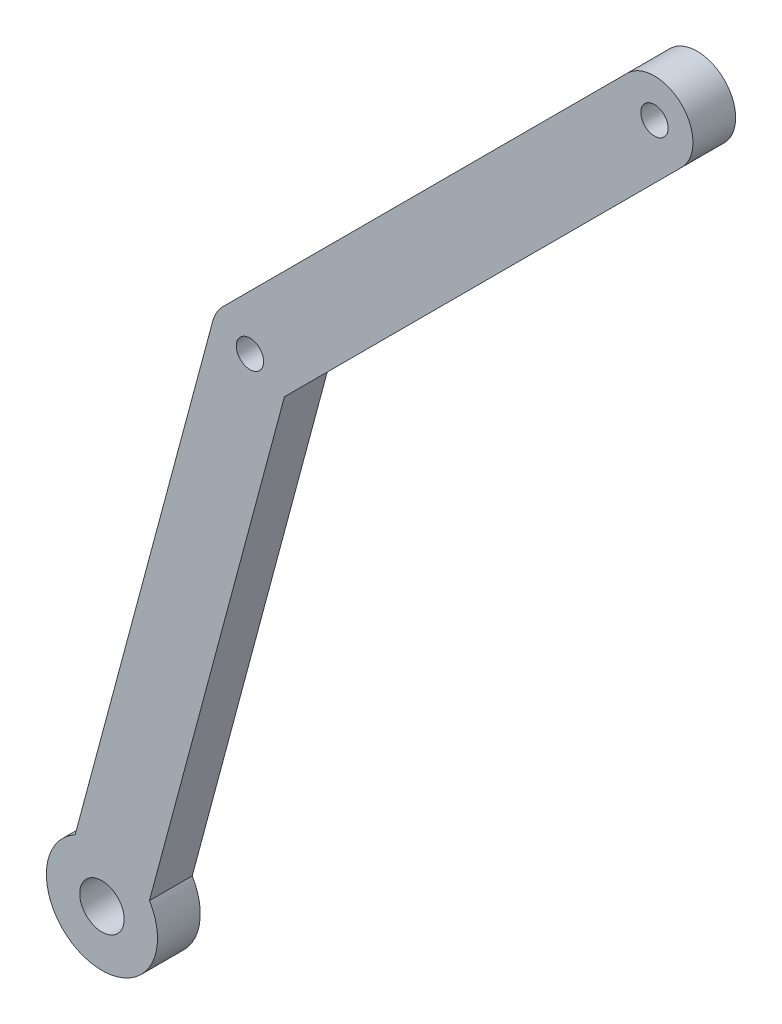
ISO-10303-21;
HEADER;
FILE_DESCRIPTION(('STEP AP214'),'2;1');
FILE_NAME('part.step','',(''),(''),'','','');
FILE_SCHEMA(('AUTOMOTIVE_DESIGN { 1 0 10303 214 1 1 1 1 }'));
ENDSEC;
DATA;
#1=APPLICATION_CONTEXT('core data for automotive mechanical design processes');
#2=APPLICATION_PROTOCOL_DEFINITION('international standard','automotive_design',2000,#1);
#3=PRODUCT_CONTEXT('',#1,'mechanical');
#4=PRODUCT('Part','Part','',(#3));
#5=PRODUCT_RELATED_PRODUCT_CATEGORY('part','',(#4));
#6=PRODUCT_DEFINITION_FORMATION('','',#4);
#7=PRODUCT_DEFINITION_CONTEXT('part definition',#1,'design');
#8=PRODUCT_DEFINITION('design','',#6,#7);
#9=PRODUCT_DEFINITION_SHAPE('','',#8);
#10=(LENGTH_UNIT() NAMED_UNIT(*) SI_UNIT(.MILLI.,.METRE.));
#11=(NAMED_UNIT(*) PLANE_ANGLE_UNIT() SI_UNIT($,.RADIAN.));
#12=(NAMED_UNIT(*) SI_UNIT($,.STERADIAN.) SOLID_ANGLE_UNIT());
#13=UNCERTAINTY_MEASURE_WITH_UNIT(LENGTH_MEASURE(1.E-05),#10,'distance_accuracy_value','');
#14=(GEOMETRIC_REPRESENTATION_CONTEXT(3) GLOBAL_UNCERTAINTY_ASSIGNED_CONTEXT((#13)) GLOBAL_UNIT_ASSIGNED_CONTEXT((#10,
#11,#12)) REPRESENTATION_CONTEXT('',''));
#15=CARTESIAN_POINT('',(0.,0.,0.));
#16=DIRECTION('',(0.,0.,1.));
#17=DIRECTION('',(1.,0.,0.));
#18=AXIS2_PLACEMENT_3D('',#15,#16,#17);
#19=CARTESIAN_POINT('',(-119.3283582089,-55.97014925373,11.));
#20=DIRECTION('',(0.,0.,1.));
#21=DIRECTION('',(1.,0.,0.));
#22=AXIS2_PLACEMENT_3D('',#19,#20,#21);
#23=CYLINDRICAL_SURFACE('',#22,2.6);
#24=DIRECTION('',(0.,0.,1.));
#25=VECTOR('',#24,1.);
#26=CARTESIAN_POINT('',(-116.7283582089,-55.97014925373,11.));
#27=LINE('',#26,#25);
#28=CARTESIAN_POINT('',(-116.7283582089,-55.97014925373,18.5));
#29=VERTEX_POINT('',#28);
#30=CARTESIAN_POINT('',(-116.7283582089,-55.97014925373,23.5));
#31=VERTEX_POINT('',#30);
#32=EDGE_CURVE('E10',#29,#31,#27,.T.);
#33=ORIENTED_EDGE('',*,*,#32,.F.);
#34=CARTESIAN_POINT('',(-119.3283582089,-55.97014925373,18.5));
#35=DIRECTION('',(0.,0.,1.));
#36=DIRECTION('',(1.,0.,0.));
#37=AXIS2_PLACEMENT_3D('',#34,#35,#36);
#38=CIRCLE('',#37,2.6);
#39=EDGE_CURVE('E175',#29,#29,#38,.T.);
#40=ORIENTED_EDGE('',*,*,#39,.F.);
#41=ORIENTED_EDGE('',*,*,#32,.T.);
#42=CARTESIAN_POINT('',(-119.3283582089,-55.97014925373,23.5));
#43=DIRECTION('',(0.,0.,1.));
#44=DIRECTION('',(1.,0.,0.));
#45=AXIS2_PLACEMENT_3D('',#42,#43,#44);
#46=CIRCLE('',#45,2.6);
#47=EDGE_CURVE('E166',#31,#31,#46,.T.);
#48=ORIENTED_EDGE('',*,*,#47,.T.);
#49=EDGE_LOOP('',(#33,#40,#41,#48));
#50=FACE_BOUND('',#49,.T.);
#51=ADVANCED_FACE('F16',(#50),#23,.F.);
#52=CARTESIAN_POINT('',(-102.0149253731,8.65671641791,11.));
#53=DIRECTION('',(0.,0.,1.));
#54=DIRECTION('',(1.,0.,0.));
#55=AXIS2_PLACEMENT_3D('',#52,#53,#54);
#56=CYLINDRICAL_SURFACE('',#55,1.6);
#57=DIRECTION('',(0.,0.,1.));
#58=VECTOR('',#57,1.);
#59=CARTESIAN_POINT('',(-100.4149253731,8.65671641791,11.));
#60=LINE('',#59,#58);
#61=CARTESIAN_POINT('',(-100.4149253731,8.65671641791,18.5));
#62=VERTEX_POINT('',#61);
#63=CARTESIAN_POINT('',(-100.4149253731,8.65671641791,23.5));
#64=VERTEX_POINT('',#63);
#65=EDGE_CURVE('E27',#62,#64,#60,.T.);
#66=ORIENTED_EDGE('',*,*,#65,.F.);
#67=CARTESIAN_POINT('',(-102.0149253731,8.65671641791,18.5));
#68=DIRECTION('',(0.,0.,1.));
#69=DIRECTION('',(1.,0.,0.));
#70=AXIS2_PLACEMENT_3D('',#67,#68,#69);
#71=CIRCLE('',#70,1.6);
#72=EDGE_CURVE('E152',#62,#62,#71,.T.);
#73=ORIENTED_EDGE('',*,*,#72,.F.);
#74=ORIENTED_EDGE('',*,*,#65,.T.);
#75=CARTESIAN_POINT('',(-102.0149253731,8.65671641791,23.5));
#76=DIRECTION('',(0.,0.,1.));
#77=DIRECTION('',(1.,0.,0.));
#78=AXIS2_PLACEMENT_3D('',#75,#76,#77);
#79=CIRCLE('',#78,1.6);
#80=EDGE_CURVE('E162',#64,#64,#79,.T.);
#81=ORIENTED_EDGE('',*,*,#80,.T.);
#82=EDGE_LOOP('',(#66,#73,#74,#81));
#83=FACE_BOUND('',#82,.T.);
#84=ADVANCED_FACE('F234',(#83),#56,.F.);
#85=CARTESIAN_POINT('',(-54.70149253731,55.970149253731,11.));
#86=DIRECTION('',(0.,0.,1.));
#87=DIRECTION('',(1.,0.,0.));
#88=AXIS2_PLACEMENT_3D('',#85,#86,#87);
#89=CYLINDRICAL_SURFACE('',#88,1.6);
#90=DIRECTION('',(0.,0.,1.));
#91=VECTOR('',#90,1.);
#92=CARTESIAN_POINT('',(-53.10149253731,55.970149253731,11.));
#93=LINE('',#92,#91);
#94=CARTESIAN_POINT('',(-53.10149253731,55.970149253731,18.5));
#95=VERTEX_POINT('',#94);
#96=CARTESIAN_POINT('',(-53.10149253731,55.970149253731,23.5));
#97=VERTEX_POINT('',#96);
#98=EDGE_CURVE('E210',#95,#97,#93,.T.);
#99=ORIENTED_EDGE('',*,*,#98,.F.);
#100=CARTESIAN_POINT('',(-54.70149253731,55.970149253731,18.5));
#101=DIRECTION('',(0.,0.,1.));
#102=DIRECTION('',(1.,0.,0.));
#103=AXIS2_PLACEMENT_3D('',#100,#101,#102);
#104=CIRCLE('',#103,1.6);
#105=EDGE_CURVE('E156',#95,#95,#104,.T.);
#106=ORIENTED_EDGE('',*,*,#105,.F.);
#107=ORIENTED_EDGE('',*,*,#98,.T.);
#108=CARTESIAN_POINT('',(-54.70149253731,55.970149253731,23.5));
#109=DIRECTION('',(0.,0.,1.));
#110=DIRECTION('',(1.,0.,0.));
#111=AXIS2_PLACEMENT_3D('',#108,#109,#110);
#112=CIRCLE('',#111,1.6);
#113=EDGE_CURVE('E167',#97,#97,#112,.T.);
#114=ORIENTED_EDGE('',*,*,#113,.T.);
#115=EDGE_LOOP('',(#99,#106,#107,#114));
#116=FACE_BOUND('',#115,.T.);
#117=ADVANCED_FACE('F266',(#116),#89,.F.);
#118=CARTESIAN_POINT('',(-97.98025491012,6.327425850246,18.5));
#119=DIRECTION('',(-0.707106781186548,0.707106781186548,0.));
#120=DIRECTION('',(0.,0.,1.));
#121=AXIS2_PLACEMENT_3D('',#118,#119,#120);
#122=PLANE('',#121);
#123=DIRECTION('',(0.707106781186548,0.707106781186548,0.));
#124=VECTOR('',#123,1.);
#125=CARTESIAN_POINT('',(-97.98025491012,6.327425850246,18.5));
#126=LINE('',#125,#124);
#127=CARTESIAN_POINT('',(-97.98025491012,6.327425850246,18.5));
#128=VERTEX_POINT('',#127);
#129=CARTESIAN_POINT('',(-51.51951202197,52.788168738392,18.5));
#130=VERTEX_POINT('',#129);
#131=EDGE_CURVE('E202',#128,#130,#126,.T.);
#132=ORIENTED_EDGE('',*,*,#131,.T.);
#133=DIRECTION('',(0.,0.,1.));
#134=VECTOR('',#133,1.);
#135=CARTESIAN_POINT('',(-51.51951202197,52.788168738392,18.5));
#136=LINE('',#135,#134);
#137=CARTESIAN_POINT('',(-51.51951202197,52.788168738392,23.5));
#138=VERTEX_POINT('',#137);
#139=EDGE_CURVE('E176',#130,#138,#136,.T.);
#140=ORIENTED_EDGE('',*,*,#139,.T.);
#141=DIRECTION('',(0.707106781186548,0.707106781186548,0.));
#142=VECTOR('',#141,1.);
#143=CARTESIAN_POINT('',(-97.98025491012,6.327425850246,23.5));
#144=LINE('',#143,#142);
#145=CARTESIAN_POINT('',(-97.98025491012,6.327425850246,23.5));
#146=VERTEX_POINT('',#145);
#147=EDGE_CURVE('E188',#146,#138,#144,.T.);
#148=ORIENTED_EDGE('',*,*,#147,.F.);
#149=DIRECTION('',(0.,0.,1.));
#150=VECTOR('',#149,1.);
#151=CARTESIAN_POINT('',(-97.98025491012,6.327425850246,18.5));
#152=LINE('',#151,#150);
#153=EDGE_CURVE('E179',#128,#146,#152,.T.);
#154=ORIENTED_EDGE('',*,*,#153,.F.);
#155=EDGE_LOOP('',(#132,#140,#148,#154));
#156=FACE_BOUND('',#155,.T.);
#157=ADVANCED_FACE('F272',(#156),#122,.F.);
#158=CARTESIAN_POINT('',(-113.7678826333,-52.603977634,18.5));
#159=DIRECTION('',(-0.965938094805052,0.258773254036014,0.));
#160=DIRECTION('',(0.,0.,1.));
#161=AXIS2_PLACEMENT_3D('',#158,#159,#160);
#162=PLANE('',#161);
#163=DIRECTION('',(0.258773254036014,0.965938094805052,0.));
#164=VECTOR('',#163,1.);
#165=CARTESIAN_POINT('',(-114.9816367823,-57.13462889689,18.5));
#166=LINE('',#165,#164);
#167=CARTESIAN_POINT('',(-113.7678826333,-52.603977634,18.5));
#168=VERTEX_POINT('',#167);
#169=EDGE_CURVE('E198',#168,#128,#166,.T.);
#170=ORIENTED_EDGE('',*,*,#169,.T.);
#171=ORIENTED_EDGE('',*,*,#153,.T.);
#172=DIRECTION('',(0.258773254036014,0.965938094805052,0.));
#173=VECTOR('',#172,1.);
#174=CARTESIAN_POINT('',(-114.9816367823,-57.13462889689,23.5));
#175=LINE('',#174,#173);
#176=CARTESIAN_POINT('',(-113.7678826333,-52.603977634,23.5));
#177=VERTEX_POINT('',#176);
#178=EDGE_CURVE('E174',#177,#146,#175,.T.);
#179=ORIENTED_EDGE('',*,*,#178,.F.);
#180=DIRECTION('',(0.,0.,1.));
#181=VECTOR('',#180,1.);
#182=CARTESIAN_POINT('',(-113.7678826333,-52.603977634,18.5));
#183=LINE('',#182,#181);
#184=EDGE_CURVE('E180',#168,#177,#183,.T.);
#185=ORIENTED_EDGE('',*,*,#184,.F.);
#186=EDGE_LOOP('',(#170,#171,#179,#185));
#187=FACE_BOUND('',#186,.T.);
#188=ADVANCED_FACE('F275',(#187),#162,.F.);
#189=CARTESIAN_POINT('',(-54.70149253731,55.970149253731,18.5));
#190=DIRECTION('',(0.,0.,-1.));
#191=DIRECTION('',(-0.707106781186548,-0.707106781186548,0.));
#192=AXIS2_PLACEMENT_3D('',#189,#190,#191);
#193=CYLINDRICAL_SURFACE('',#192,4.5);
#194=DIRECTION('',(0.,0.,1.));
#195=VECTOR('',#194,1.);
#196=CARTESIAN_POINT('',(-57.88347305265,59.152129769071,18.5));
#197=LINE('',#196,#195);
#198=CARTESIAN_POINT('',(-57.88347305265,59.152129769071,18.5));
#199=VERTEX_POINT('',#198);
#200=CARTESIAN_POINT('',(-57.88347305265,59.152129769071,23.5));
#201=VERTEX_POINT('',#200);
#202=EDGE_CURVE('E184',#199,#201,#197,.T.);
#203=ORIENTED_EDGE('',*,*,#202,.T.);
#204=CARTESIAN_POINT('',(-54.70149253731,55.970149253731,23.5));
#205=DIRECTION('',(0.,0.,-1.));
#206=DIRECTION('',(-0.707106781186548,-0.707106781186548,0.));
#207=AXIS2_PLACEMENT_3D('',#204,#205,#206);
#208=CIRCLE('',#207,4.5);
#209=EDGE_CURVE('E191',#201,#138,#208,.T.);
#210=ORIENTED_EDGE('',*,*,#209,.T.);
#211=ORIENTED_EDGE('',*,*,#139,.F.);
#212=CARTESIAN_POINT('',(-54.70149253731,55.970149253731,18.5));
#213=DIRECTION('',(0.,0.,-1.));
#214=DIRECTION('',(-0.707106781186548,-0.707106781186548,0.));
#215=AXIS2_PLACEMENT_3D('',#212,#213,#214);
#216=CIRCLE('',#215,4.5);
#217=EDGE_CURVE('E225',#199,#130,#216,.T.);
#218=ORIENTED_EDGE('',*,*,#217,.F.);
#219=EDGE_LOOP('',(#203,#210,#211,#218));
#220=FACE_BOUND('',#219,.T.);
#221=ADVANCED_FACE('F270',(#220),#193,.T.);
#222=CARTESIAN_POINT('',(-119.3283582089,-55.97014925373,18.5));
#223=DIRECTION('',(0.,0.,-1.));
#224=DIRECTION('',(-0.48199496579594,0.876173985545891,0.));
#225=AXIS2_PLACEMENT_3D('',#222,#223,#224);
#226=CYLINDRICAL_SURFACE('',#225,6.5);
#227=CARTESIAN_POINT('',(-119.3283582089,-55.97014925373,18.5));
#228=DIRECTION('',(0.,0.,1.));
#229=DIRECTION('',(-0.48199496579594,0.876173985545891,0.));
#230=AXIS2_PLACEMENT_3D('',#227,#228,#229);
#231=CIRCLE('',#230,6.5);
#232=CARTESIAN_POINT('',(-122.4613254866,-50.27501834768,18.5));
#233=VERTEX_POINT('',#232);
#234=EDGE_CURVE('E20',#233,#168,#231,.T.);
#235=ORIENTED_EDGE('',*,*,#234,.T.);
#236=ORIENTED_EDGE('',*,*,#184,.T.);
#237=CARTESIAN_POINT('',(-119.3283582089,-55.97014925373,23.5));
#238=DIRECTION('',(0.,0.,1.));
#239=DIRECTION('',(-0.48199496579594,0.876173985545891,0.));
#240=AXIS2_PLACEMENT_3D('',#237,#238,#239);
#241=CIRCLE('',#240,6.5);
#242=CARTESIAN_POINT('',(-122.4613254866,-50.27501834768,23.5));
#243=VERTEX_POINT('',#242);
#244=EDGE_CURVE('E170',#243,#177,#241,.T.);
#245=ORIENTED_EDGE('',*,*,#244,.F.);
#246=DIRECTION('',(0.,0.,1.));
#247=VECTOR('',#246,1.);
#248=CARTESIAN_POINT('',(-122.4613254866,-50.27501834768,18.5));
#249=LINE('',#248,#247);
#250=EDGE_CURVE('E130',#233,#243,#249,.T.);
#251=ORIENTED_EDGE('',*,*,#250,.F.);
#252=EDGE_LOOP('',(#235,#236,#245,#251));
#253=FACE_BOUND('',#252,.T.);
#254=ADVANCED_FACE('F18',(#253),#226,.T.);
#255=CARTESIAN_POINT('',(-78.35820895522,32.313432835821,23.5));
#256=DIRECTION('',(0.,0.,1.));
#257=DIRECTION('',(1.,0.,0.));
#258=AXIS2_PLACEMENT_3D('',#255,#256,#257);
#259=PLANE('',#258);
#260=ORIENTED_EDGE('',*,*,#47,.F.);
#261=EDGE_LOOP('',(#260));
#262=FACE_BOUND('',#261,.T.);
#263=ORIENTED_EDGE('',*,*,#80,.F.);
#264=EDGE_LOOP('',(#263));
#265=FACE_BOUND('',#264,.T.);
#266=ORIENTED_EDGE('',*,*,#113,.F.);
#267=EDGE_LOOP('',(#266));
#268=FACE_BOUND('',#267,.T.);
#269=CARTESIAN_POINT('',(-102.0149253731,8.65671641791,23.5));
#270=DIRECTION('',(0.,0.,-1.));
#271=DIRECTION('',(0.707106781186548,0.707106781186548,0.));
#272=AXIS2_PLACEMENT_3D('',#269,#270,#271);
#273=CIRCLE('',#272,4.5);
#274=CARTESIAN_POINT('',(-106.3616467997,9.82119606107,23.5));
#275=VERTEX_POINT('',#274);
#276=CARTESIAN_POINT('',(-105.1969058884,11.83869693325,23.5));
#277=VERTEX_POINT('',#276);
#278=EDGE_CURVE('E143',#275,#277,#273,.T.);
#279=ORIENTED_EDGE('',*,*,#278,.F.);
#280=DIRECTION('',(-0.258773254036014,-0.965938094805052,0.));
#281=VECTOR('',#280,1.);
#282=CARTESIAN_POINT('',(-106.3616467997,9.82119606107,23.5));
#283=LINE('',#282,#281);
#284=EDGE_CURVE('E112',#275,#243,#283,.T.);
#285=ORIENTED_EDGE('',*,*,#284,.T.);
#286=ORIENTED_EDGE('',*,*,#244,.T.);
#287=ORIENTED_EDGE('',*,*,#178,.T.);
#288=ORIENTED_EDGE('',*,*,#147,.T.);
#289=ORIENTED_EDGE('',*,*,#209,.F.);
#290=DIRECTION('',(-0.707106781186548,-0.707106781186548,0.));
#291=VECTOR('',#290,1.);
#292=CARTESIAN_POINT('',(-57.88347305265,59.152129769071,23.5));
#293=LINE('',#292,#291);
#294=EDGE_CURVE('E181',#201,#277,#293,.T.);
#295=ORIENTED_EDGE('',*,*,#294,.T.);
#296=EDGE_LOOP('',(#279,#285,#286,#287,#288,#289,#295));
#297=FACE_BOUND('',#296,.T.);
#298=ADVANCED_FACE('F237',(#262,#265,#268,#297),#259,.T.);
#299=CARTESIAN_POINT('',(-78.35820895522,32.313432835821,18.5));
#300=DIRECTION('',(0.,0.,1.));
#301=DIRECTION('',(1.,0.,0.));
#302=AXIS2_PLACEMENT_3D('',#299,#300,#301);
#303=PLANE('',#302);
#304=ORIENTED_EDGE('',*,*,#39,.T.);
#305=EDGE_LOOP('',(#304));
#306=FACE_BOUND('',#305,.T.);
#307=ORIENTED_EDGE('',*,*,#72,.T.);
#308=EDGE_LOOP('',(#307));
#309=FACE_BOUND('',#308,.T.);
#310=ORIENTED_EDGE('',*,*,#105,.T.);
#311=EDGE_LOOP('',(#310));
#312=FACE_BOUND('',#311,.T.);
#313=DIRECTION('',(-0.707106781186548,-0.707106781186548,0.));
#314=VECTOR('',#313,1.);
#315=CARTESIAN_POINT('',(-57.88347305265,59.152129769071,18.5));
#316=LINE('',#315,#314);
#317=CARTESIAN_POINT('',(-105.1969058884,11.83869693325,18.5));
#318=VERTEX_POINT('',#317);
#319=EDGE_CURVE('E155',#199,#318,#316,.T.);
#320=ORIENTED_EDGE('',*,*,#319,.F.);
#321=ORIENTED_EDGE('',*,*,#217,.T.);
#322=ORIENTED_EDGE('',*,*,#131,.F.);
#323=ORIENTED_EDGE('',*,*,#169,.F.);
#324=ORIENTED_EDGE('',*,*,#234,.F.);
#325=DIRECTION('',(-0.258773254036014,-0.965938094805052,0.));
#326=VECTOR('',#325,1.);
#327=CARTESIAN_POINT('',(-106.3616467997,9.82119606107,18.5));
#328=LINE('',#327,#326);
#329=CARTESIAN_POINT('',(-106.3616467997,9.82119606107,18.5));
#330=VERTEX_POINT('',#329);
#331=EDGE_CURVE('E120',#330,#233,#328,.T.);
#332=ORIENTED_EDGE('',*,*,#331,.F.);
#333=CARTESIAN_POINT('',(-102.0149253731,8.65671641791,18.5));
#334=DIRECTION('',(0.,0.,-1.));
#335=DIRECTION('',(0.707106781186548,0.707106781186548,0.));
#336=AXIS2_PLACEMENT_3D('',#333,#334,#335);
#337=CIRCLE('',#336,4.5);
#338=EDGE_CURVE('E124',#330,#318,#337,.T.);
#339=ORIENTED_EDGE('',*,*,#338,.T.);
#340=EDGE_LOOP('',(#320,#321,#322,#323,#324,#332,#339));
#341=FACE_BOUND('',#340,.T.);
#342=ADVANCED_FACE('F123',(#306,#309,#312,#341),#303,.F.);
#343=CARTESIAN_POINT('',(-57.88347305265,59.152129769071,18.5));
#344=DIRECTION('',(0.707106781186548,-0.707106781186548,0.));
#345=DIRECTION('',(0.,0.,-1.));
#346=AXIS2_PLACEMENT_3D('',#343,#344,#345);
#347=PLANE('',#346);
#348=ORIENTED_EDGE('',*,*,#319,.T.);
#349=DIRECTION('',(0.,0.,1.));
#350=VECTOR('',#349,1.);
#351=CARTESIAN_POINT('',(-105.1969058884,11.83869693325,18.5));
#352=LINE('',#351,#350);
#353=EDGE_CURVE('E138',#318,#277,#352,.T.);
#354=ORIENTED_EDGE('',*,*,#353,.T.);
#355=ORIENTED_EDGE('',*,*,#294,.F.);
#356=ORIENTED_EDGE('',*,*,#202,.F.);
#357=EDGE_LOOP('',(#348,#354,#355,#356));
#358=FACE_BOUND('',#357,.T.);
#359=ADVANCED_FACE('F247',(#358),#347,.F.);
#360=CARTESIAN_POINT('',(-106.3616467997,9.82119606107,18.5));
#361=DIRECTION('',(0.965938094805052,-0.258773254036014,0.));
#362=DIRECTION('',(0.,0.,-1.));
#363=AXIS2_PLACEMENT_3D('',#360,#361,#362);
#364=PLANE('',#363);
#365=ORIENTED_EDGE('',*,*,#331,.T.);
#366=ORIENTED_EDGE('',*,*,#250,.T.);
#367=ORIENTED_EDGE('',*,*,#284,.F.);
#368=DIRECTION('',(0.,0.,1.));
#369=VECTOR('',#368,1.);
#370=CARTESIAN_POINT('',(-106.3616467997,9.82119606107,18.5));
#371=LINE('',#370,#369);
#372=EDGE_CURVE('E136',#330,#275,#371,.T.);
#373=ORIENTED_EDGE('',*,*,#372,.F.);
#374=EDGE_LOOP('',(#365,#366,#367,#373));
#375=FACE_BOUND('',#374,.T.);
#376=ADVANCED_FACE('F141',(#375),#364,.F.);
#377=CARTESIAN_POINT('',(-102.0149253731,8.65671641791,18.5));
#378=DIRECTION('',(0.,0.,-1.));
#379=DIRECTION('',(0.707106781186548,0.707106781186548,0.));
#380=AXIS2_PLACEMENT_3D('',#377,#378,#379);
#381=CYLINDRICAL_SURFACE('',#380,4.5);
#382=ORIENTED_EDGE('',*,*,#372,.T.);
#383=ORIENTED_EDGE('',*,*,#278,.T.);
#384=ORIENTED_EDGE('',*,*,#353,.F.);
#385=ORIENTED_EDGE('',*,*,#338,.F.);
#386=EDGE_LOOP('',(#382,#383,#384,#385));
#387=FACE_BOUND('',#386,.T.);
#388=ADVANCED_FACE('F134',(#387),#381,.T.);
#389=CLOSED_SHELL('',(#51,#84,#117,#157,#188,#221,#254,#298,#342,#359,#376,#388));
#390=MANIFOLD_SOLID_BREP('B1',#389);
#391=ADVANCED_BREP_SHAPE_REPRESENTATION('',(#18,#390),#14);
#392=SHAPE_DEFINITION_REPRESENTATION(#9,#391);
ENDSEC;
END-ISO-10303-21;
